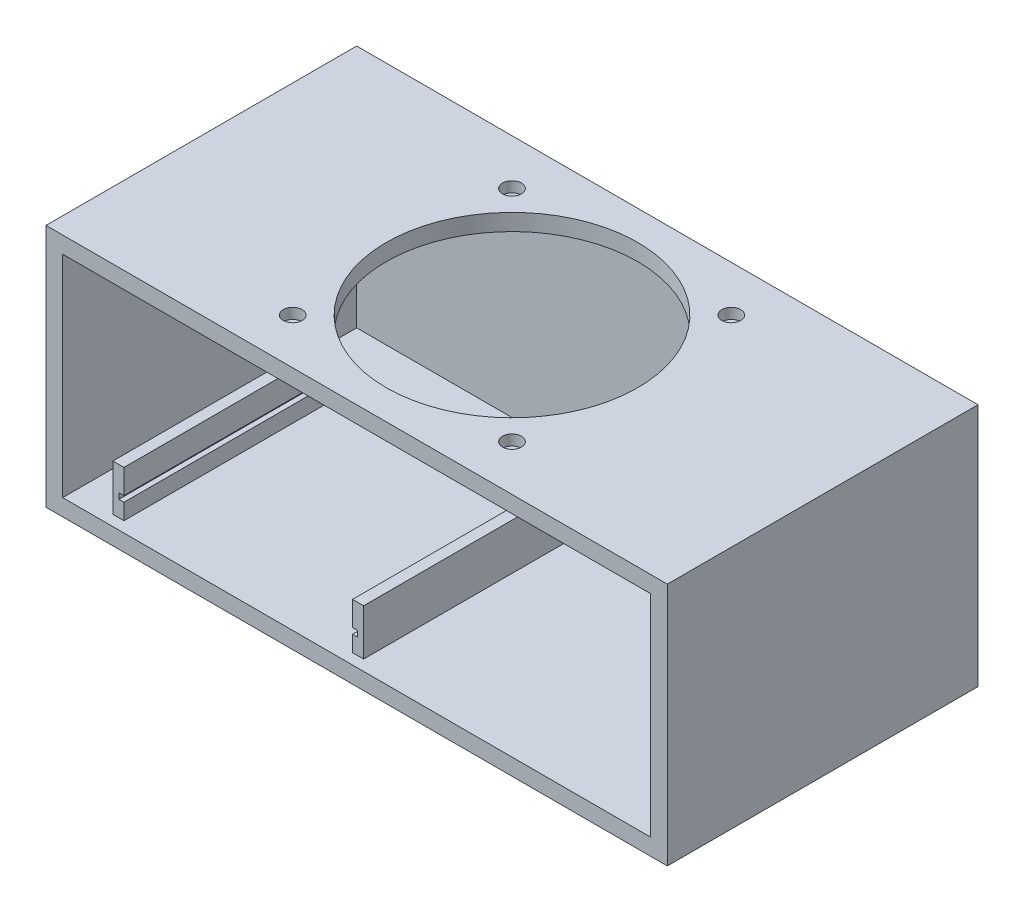
ISO-10303-21;
HEADER;
FILE_DESCRIPTION(('STEP AP214'),'2;1');
FILE_NAME('part.step','',(''),(''),'','','');
FILE_SCHEMA(('AUTOMOTIVE_DESIGN { 1 0 10303 214 1 1 1 1 }'));
ENDSEC;
DATA;
#1=APPLICATION_CONTEXT('core data for automotive mechanical design processes');
#2=APPLICATION_PROTOCOL_DEFINITION('international standard','automotive_design',2000,#1);
#3=PRODUCT_CONTEXT('',#1,'mechanical');
#4=PRODUCT('Part','Part','',(#3));
#5=PRODUCT_RELATED_PRODUCT_CATEGORY('part','',(#4));
#6=PRODUCT_DEFINITION_FORMATION('','',#4);
#7=PRODUCT_DEFINITION_CONTEXT('part definition',#1,'design');
#8=PRODUCT_DEFINITION('design','',#6,#7);
#9=PRODUCT_DEFINITION_SHAPE('','',#8);
#10=(LENGTH_UNIT() NAMED_UNIT(*) SI_UNIT(.MILLI.,.METRE.));
#11=(NAMED_UNIT(*) PLANE_ANGLE_UNIT() SI_UNIT($,.RADIAN.));
#12=(NAMED_UNIT(*) SI_UNIT($,.STERADIAN.) SOLID_ANGLE_UNIT());
#13=UNCERTAINTY_MEASURE_WITH_UNIT(LENGTH_MEASURE(1.E-05),#10,'distance_accuracy_value','');
#14=(GEOMETRIC_REPRESENTATION_CONTEXT(3) GLOBAL_UNCERTAINTY_ASSIGNED_CONTEXT((#13)) GLOBAL_UNIT_ASSIGNED_CONTEXT((#10,
#11,#12)) REPRESENTATION_CONTEXT('',''));
#15=CARTESIAN_POINT('',(0.,0.,0.));
#16=DIRECTION('',(0.,0.,1.));
#17=DIRECTION('',(1.,0.,0.));
#18=AXIS2_PLACEMENT_3D('',#15,#16,#17);
#19=CARTESIAN_POINT('',(-72.8217937762542,17.9705,41.4010618553118));
#20=DIRECTION('',(0.,0.,-1.));
#21=DIRECTION('',(-1.,0.,0.));
#22=AXIS2_PLACEMENT_3D('',#19,#20,#21);
#23=PLANE('',#22);
#24=DIRECTION('',(-1.,0.,0.));
#25=VECTOR('',#24,1.);
#26=CARTESIAN_POINT('',(-69.6467937762542,10.9855,41.4010618553118));
#27=LINE('',#26,#25);
#28=CARTESIAN_POINT('',(-69.6467937762542,10.9855,41.4010618553118));
#29=VERTEX_POINT('',#28);
#30=CARTESIAN_POINT('',(-71.0938670084245,10.9855,41.4010618553118));
#31=VERTEX_POINT('',#30);
#32=EDGE_CURVE('E265',#29,#31,#27,.T.);
#33=ORIENTED_EDGE('',*,*,#32,.F.);
#34=DIRECTION('',(0.,-1.,0.));
#35=VECTOR('',#34,1.);
#36=CARTESIAN_POINT('',(-69.6467937762542,17.9705,41.4010618553118));
#37=LINE('',#36,#35);
#38=CARTESIAN_POINT('',(-69.6467937762542,17.9705,41.4010618553118));
#39=VERTEX_POINT('',#38);
#40=EDGE_CURVE('E238',#39,#29,#37,.T.);
#41=ORIENTED_EDGE('',*,*,#40,.F.);
#42=DIRECTION('',(1.,0.,0.));
#43=VECTOR('',#42,1.);
#44=CARTESIAN_POINT('',(-72.8217937762542,17.9705,41.4010618553118));
#45=LINE('',#44,#43);
#46=CARTESIAN_POINT('',(-72.8217937762542,17.9705,41.4010618553118));
#47=VERTEX_POINT('',#46);
#48=EDGE_CURVE('E321',#47,#39,#45,.T.);
#49=ORIENTED_EDGE('',*,*,#48,.F.);
#50=DIRECTION('',(0.,-1.,0.));
#51=VECTOR('',#50,1.);
#52=CARTESIAN_POINT('',(-72.8217937762542,17.9705,41.4010618553118));
#53=LINE('',#52,#51);
#54=CARTESIAN_POINT('',(-72.8217937762542,4.7625,41.4010618553118));
#55=VERTEX_POINT('',#54);
#56=EDGE_CURVE('E317',#47,#55,#53,.T.);
#57=ORIENTED_EDGE('',*,*,#56,.T.);
#58=DIRECTION('',(1.,0.,0.));
#59=VECTOR('',#58,1.);
#60=CARTESIAN_POINT('',(-72.8217937762542,4.7625,41.4010618553118));
#61=LINE('',#60,#59);
#62=CARTESIAN_POINT('',(-69.6467937762542,4.7625,41.4010618553118));
#63=VERTEX_POINT('',#62);
#64=EDGE_CURVE('E290',#55,#63,#61,.T.);
#65=ORIENTED_EDGE('',*,*,#64,.T.);
#66=CARTESIAN_POINT('',(-69.6467937762542,9.3345,41.4010618553118));
#67=VERTEX_POINT('',#66);
#68=EDGE_CURVE('E309',#67,#63,#37,.T.);
#69=ORIENTED_EDGE('',*,*,#68,.F.);
#70=DIRECTION('',(1.,0.,0.));
#71=VECTOR('',#70,1.);
#72=CARTESIAN_POINT('',(-71.0938670084245,9.3345,41.4010618553118));
#73=LINE('',#72,#71);
#74=CARTESIAN_POINT('',(-71.0938670084245,9.3345,41.4010618553118));
#75=VERTEX_POINT('',#74);
#76=EDGE_CURVE('E231',#75,#67,#73,.T.);
#77=ORIENTED_EDGE('',*,*,#76,.F.);
#78=DIRECTION('',(0.,-1.,0.));
#79=VECTOR('',#78,1.);
#80=CARTESIAN_POINT('',(-71.0938670084245,10.9855,41.4010618553118));
#81=LINE('',#80,#79);
#82=EDGE_CURVE('E804',#31,#75,#81,.T.);
#83=ORIENTED_EDGE('',*,*,#82,.F.);
#84=EDGE_LOOP('',(#33,#41,#49,#57,#65,#69,#77,#83));
#85=FACE_BOUND('',#84,.T.);
#86=ADVANCED_FACE('F54',(#85),#23,.F.);
#87=CARTESIAN_POINT('',(-1.80962252424003E-13,17.9705,41.4010618553118));
#88=DIRECTION('',(0.,0.,-1.));
#89=DIRECTION('',(-1.,0.,0.));
#90=AXIS2_PLACEMENT_3D('',#87,#88,#89);
#91=PLANE('',#90);
#92=DIRECTION('',(-1.,0.,0.));
#93=VECTOR('',#92,1.);
#94=CARTESIAN_POINT('',(-4.24179377625425,10.9855,41.4010618553118));
#95=LINE('',#94,#93);
#96=CARTESIAN_POINT('',(-2.79472054408396,10.9855,41.4010618553118));
#97=VERTEX_POINT('',#96);
#98=CARTESIAN_POINT('',(-4.24179377625425,10.9855,41.4010618553118));
#99=VERTEX_POINT('',#98);
#100=EDGE_CURVE('E257',#97,#99,#95,.T.);
#101=ORIENTED_EDGE('',*,*,#100,.F.);
#102=DIRECTION('',(0.,1.,0.));
#103=VECTOR('',#102,1.);
#104=CARTESIAN_POINT('',(-2.79472054408396,10.9855,41.4010618553118));
#105=LINE('',#104,#103);
#106=CARTESIAN_POINT('',(-2.79472054408396,9.3345,41.4010618553118));
#107=VERTEX_POINT('',#106);
#108=EDGE_CURVE('E256',#107,#97,#105,.T.);
#109=ORIENTED_EDGE('',*,*,#108,.F.);
#110=DIRECTION('',(1.,0.,0.));
#111=VECTOR('',#110,1.);
#112=CARTESIAN_POINT('',(-2.79472054408396,9.3345,41.4010618553118));
#113=LINE('',#112,#111);
#114=CARTESIAN_POINT('',(-4.24179377625425,9.3345,41.4010618553118));
#115=VERTEX_POINT('',#114);
#116=EDGE_CURVE('E79',#115,#107,#113,.T.);
#117=ORIENTED_EDGE('',*,*,#116,.F.);
#118=DIRECTION('',(0.,-1.,0.));
#119=VECTOR('',#118,1.);
#120=CARTESIAN_POINT('',(-4.24179377625425,17.9705,41.4010618553118));
#121=LINE('',#120,#119);
#122=CARTESIAN_POINT('',(-4.24179377625425,4.7625,41.4010618553118));
#123=VERTEX_POINT('',#122);
#124=EDGE_CURVE('E300',#115,#123,#121,.T.);
#125=ORIENTED_EDGE('',*,*,#124,.T.);
#126=DIRECTION('',(1.,0.,0.));
#127=VECTOR('',#126,1.);
#128=CARTESIAN_POINT('',(-1.80962252424003E-13,4.7625,41.4010618553118));
#129=LINE('',#128,#127);
#130=CARTESIAN_POINT('',(-1.0667937762542,4.7625,41.4010618553118));
#131=VERTEX_POINT('',#130);
#132=EDGE_CURVE('E277',#123,#131,#129,.T.);
#133=ORIENTED_EDGE('',*,*,#132,.T.);
#134=DIRECTION('',(0.,-1.,0.));
#135=VECTOR('',#134,1.);
#136=CARTESIAN_POINT('',(-1.0667937762542,17.9705,41.4010618553118));
#137=LINE('',#136,#135);
#138=CARTESIAN_POINT('',(-1.0667937762542,17.9705,41.4010618553118));
#139=VERTEX_POINT('',#138);
#140=EDGE_CURVE('E285',#139,#131,#137,.T.);
#141=ORIENTED_EDGE('',*,*,#140,.F.);
#142=DIRECTION('',(1.,0.,0.));
#143=VECTOR('',#142,1.);
#144=CARTESIAN_POINT('',(-1.80962252424003E-13,17.9705,41.4010618553118));
#145=LINE('',#144,#143);
#146=CARTESIAN_POINT('',(-4.24179377625425,17.9705,41.4010618553118));
#147=VERTEX_POINT('',#146);
#148=EDGE_CURVE('E278',#147,#139,#145,.T.);
#149=ORIENTED_EDGE('',*,*,#148,.F.);
#150=EDGE_CURVE('E296',#147,#99,#121,.T.);
#151=ORIENTED_EDGE('',*,*,#150,.T.);
#152=EDGE_LOOP('',(#101,#109,#117,#125,#133,#141,#149,#151));
#153=FACE_BOUND('',#152,.T.);
#154=ADVANCED_FACE('F455',(#153),#91,.F.);
#155=CARTESIAN_POINT('',(0.,4.7625,0.));
#156=DIRECTION('',(0.,-1.,0.));
#157=DIRECTION('',(0.,0.,-1.));
#158=AXIS2_PLACEMENT_3D('',#155,#156,#157);
#159=PLANE('',#158);
#160=ORIENTED_EDGE('',*,*,#64,.F.);
#161=DIRECTION('',(0.,0.,1.));
#162=VECTOR('',#161,1.);
#163=CARTESIAN_POINT('',(-72.8217937762542,4.7625,0.));
#164=LINE('',#163,#162);
#165=CARTESIAN_POINT('',(-72.8217937762542,4.7625,-17.5496859054574));
#166=VERTEX_POINT('',#165);
#167=EDGE_CURVE('E318',#166,#55,#164,.T.);
#168=ORIENTED_EDGE('',*,*,#167,.F.);
#169=DIRECTION('',(1.,0.,0.));
#170=VECTOR('',#169,1.);
#171=CARTESIAN_POINT('',(-72.8217937762542,4.7625,-17.5496859054574));
#172=LINE('',#171,#170);
#173=CARTESIAN_POINT('',(-69.6467937762542,4.7625,-17.5496859054574));
#174=VERTEX_POINT('',#173);
#175=EDGE_CURVE('E324',#166,#174,#172,.T.);
#176=ORIENTED_EDGE('',*,*,#175,.T.);
#177=DIRECTION('',(0.,0.,-1.));
#178=VECTOR('',#177,1.);
#179=CARTESIAN_POINT('',(-69.6467937762542,4.7625,41.4010618553118));
#180=LINE('',#179,#178);
#181=EDGE_CURVE('E326',#63,#174,#180,.T.);
#182=ORIENTED_EDGE('',*,*,#181,.F.);
#183=EDGE_LOOP('',(#160,#168,#176,#182));
#184=FACE_BOUND('',#183,.T.);
#185=DIRECTION('',(0.,0.,-1.));
#186=VECTOR('',#185,1.);
#187=CARTESIAN_POINT('',(84.1375,4.7625,0.));
#188=LINE('',#187,#186);
#189=CARTESIAN_POINT('',(84.1375,4.7625,44.45));
#190=VERTEX_POINT('',#189);
#191=CARTESIAN_POINT('',(84.1375,4.7625,-39.6875));
#192=VERTEX_POINT('',#191);
#193=EDGE_CURVE('E362',#190,#192,#188,.T.);
#194=ORIENTED_EDGE('',*,*,#193,.T.);
#195=DIRECTION('',(-1.,0.,0.));
#196=VECTOR('',#195,1.);
#197=CARTESIAN_POINT('',(0.,4.7625,-39.6875));
#198=LINE('',#197,#196);
#199=CARTESIAN_POINT('',(-84.1375,4.7625,-39.6875));
#200=VERTEX_POINT('',#199);
#201=EDGE_CURVE('E368',#192,#200,#198,.T.);
#202=ORIENTED_EDGE('',*,*,#201,.T.);
#203=DIRECTION('',(0.,0.,1.));
#204=VECTOR('',#203,1.);
#205=CARTESIAN_POINT('',(-84.1375,4.7625,0.));
#206=LINE('',#205,#204);
#207=CARTESIAN_POINT('',(-84.1375,4.7625,44.45));
#208=VERTEX_POINT('',#207);
#209=EDGE_CURVE('E379',#200,#208,#206,.T.);
#210=ORIENTED_EDGE('',*,*,#209,.T.);
#211=DIRECTION('',(1.,0.,0.));
#212=VECTOR('',#211,1.);
#213=CARTESIAN_POINT('',(0.,4.7625,44.45));
#214=LINE('',#213,#212);
#215=EDGE_CURVE('E377',#208,#190,#214,.T.);
#216=ORIENTED_EDGE('',*,*,#215,.T.);
#217=EDGE_LOOP('',(#194,#202,#210,#216));
#218=FACE_BOUND('',#217,.T.);
#219=DIRECTION('',(0.,0.,-1.));
#220=VECTOR('',#219,1.);
#221=CARTESIAN_POINT('',(-1.0667937762542,4.7625,0.));
#222=LINE('',#221,#220);
#223=CARTESIAN_POINT('',(-1.0667937762542,4.7625,-17.5496859054574));
#224=VERTEX_POINT('',#223);
#225=EDGE_CURVE('E282',#131,#224,#222,.T.);
#226=ORIENTED_EDGE('',*,*,#225,.F.);
#227=ORIENTED_EDGE('',*,*,#132,.F.);
#228=DIRECTION('',(0.,0.,1.));
#229=VECTOR('',#228,1.);
#230=CARTESIAN_POINT('',(-4.24179377625425,4.7625,0.));
#231=LINE('',#230,#229);
#232=CARTESIAN_POINT('',(-4.24179377625425,4.7625,-17.5496859054574));
#233=VERTEX_POINT('',#232);
#234=EDGE_CURVE('E289',#233,#123,#231,.T.);
#235=ORIENTED_EDGE('',*,*,#234,.F.);
#236=DIRECTION('',(-1.,0.,0.));
#237=VECTOR('',#236,1.);
#238=CARTESIAN_POINT('',(0.,4.7625,-17.5496859054574));
#239=LINE('',#238,#237);
#240=EDGE_CURVE('E286',#224,#233,#239,.T.);
#241=ORIENTED_EDGE('',*,*,#240,.F.);
#242=EDGE_LOOP('',(#226,#227,#235,#241));
#243=FACE_BOUND('',#242,.T.);
#244=ADVANCED_FACE('F458',(#184,#218,#243),#159,.F.);
#245=CARTESIAN_POINT('',(0.,69.85,0.));
#246=DIRECTION('',(0.,-1.,0.));
#247=DIRECTION('',(0.,0.,-1.));
#248=AXIS2_PLACEMENT_3D('',#245,#246,#247);
#249=PLANE('',#248);
#250=CARTESIAN_POINT('',(31.3735987917704,69.85,31.373598791771));
#251=DIRECTION('',(0.,1.,0.));
#252=DIRECTION('',(0.,0.,1.));
#253=AXIS2_PLACEMENT_3D('',#250,#251,#252);
#254=CIRCLE('',#253,2.7);
#255=CARTESIAN_POINT('',(31.3735987917704,69.85,34.073598791771));
#256=VERTEX_POINT('',#255);
#257=EDGE_CURVE('E339',#256,#256,#254,.T.);
#258=ORIENTED_EDGE('',*,*,#257,.F.);
#259=EDGE_LOOP('',(#258));
#260=FACE_BOUND('',#259,.T.);
#261=CARTESIAN_POINT('',(-31.3735987917704,69.85,31.373598791771));
#262=DIRECTION('',(0.,-1.,0.));
#263=DIRECTION('',(0.,0.,-1.));
#264=AXIS2_PLACEMENT_3D('',#261,#262,#263);
#265=CIRCLE('',#264,2.7);
#266=CARTESIAN_POINT('',(-31.3735987917704,69.85,28.673598791771));
#267=VERTEX_POINT('',#266);
#268=EDGE_CURVE('E345',#267,#267,#265,.T.);
#269=ORIENTED_EDGE('',*,*,#268,.T.);
#270=EDGE_LOOP('',(#269));
#271=FACE_BOUND('',#270,.T.);
#272=CARTESIAN_POINT('',(0.,69.85,0.));
#273=DIRECTION('',(0.,1.,0.));
#274=DIRECTION('',(0.,0.,1.));
#275=AXIS2_PLACEMENT_3D('',#272,#273,#274);
#276=CIRCLE('',#275,36.);
#277=CARTESIAN_POINT('',(0.,69.85,36.));
#278=VERTEX_POINT('',#277);
#279=EDGE_CURVE('E359',#278,#278,#276,.T.);
#280=ORIENTED_EDGE('',*,*,#279,.F.);
#281=EDGE_LOOP('',(#280));
#282=FACE_BOUND('',#281,.T.);
#283=DIRECTION('',(0.,0.,-1.));
#284=VECTOR('',#283,1.);
#285=CARTESIAN_POINT('',(88.9,69.85,44.45));
#286=LINE('',#285,#284);
#287=CARTESIAN_POINT('',(88.9,69.85,44.45));
#288=VERTEX_POINT('',#287);
#289=CARTESIAN_POINT('',(88.9,69.85,-44.45));
#290=VERTEX_POINT('',#289);
#291=EDGE_CURVE('E397',#288,#290,#286,.T.);
#292=ORIENTED_EDGE('',*,*,#291,.T.);
#293=DIRECTION('',(-1.,0.,0.));
#294=VECTOR('',#293,1.);
#295=CARTESIAN_POINT('',(-88.9,69.85,-44.45));
#296=LINE('',#295,#294);
#297=CARTESIAN_POINT('',(-88.9,69.85,-44.45));
#298=VERTEX_POINT('',#297);
#299=EDGE_CURVE('E402',#290,#298,#296,.T.);
#300=ORIENTED_EDGE('',*,*,#299,.T.);
#301=DIRECTION('',(0.,0.,1.));
#302=VECTOR('',#301,1.);
#303=CARTESIAN_POINT('',(-88.9,69.85,44.45));
#304=LINE('',#303,#302);
#305=CARTESIAN_POINT('',(-88.9,69.85,44.45));
#306=VERTEX_POINT('',#305);
#307=EDGE_CURVE('E404',#298,#306,#304,.T.);
#308=ORIENTED_EDGE('',*,*,#307,.T.);
#309=DIRECTION('',(1.,0.,0.));
#310=VECTOR('',#309,1.);
#311=CARTESIAN_POINT('',(-88.9,69.85,44.45));
#312=LINE('',#311,#310);
#313=EDGE_CURVE('E407',#306,#288,#312,.T.);
#314=ORIENTED_EDGE('',*,*,#313,.T.);
#315=EDGE_LOOP('',(#292,#300,#308,#314));
#316=FACE_BOUND('',#315,.T.);
#317=CARTESIAN_POINT('',(31.3735987917709,69.85,-31.373598791771));
#318=DIRECTION('',(0.,-1.,0.));
#319=DIRECTION('',(0.,0.,-1.));
#320=AXIS2_PLACEMENT_3D('',#317,#318,#319);
#321=CIRCLE('',#320,2.7);
#322=CARTESIAN_POINT('',(31.3735987917709,69.85,-34.073598791771));
#323=VERTEX_POINT('',#322);
#324=EDGE_CURVE('E346',#323,#323,#321,.T.);
#325=ORIENTED_EDGE('',*,*,#324,.T.);
#326=EDGE_LOOP('',(#325));
#327=FACE_BOUND('',#326,.T.);
#328=CARTESIAN_POINT('',(-31.3735987917709,69.85,-31.373598791771));
#329=DIRECTION('',(0.,1.,0.));
#330=DIRECTION('',(0.,0.,1.));
#331=AXIS2_PLACEMENT_3D('',#328,#329,#330);
#332=CIRCLE('',#331,2.7);
#333=CARTESIAN_POINT('',(-31.3735987917709,69.85,-28.673598791771));
#334=VERTEX_POINT('',#333);
#335=EDGE_CURVE('E355',#334,#334,#332,.T.);
#336=ORIENTED_EDGE('',*,*,#335,.F.);
#337=EDGE_LOOP('',(#336));
#338=FACE_BOUND('',#337,.T.);
#339=ADVANCED_FACE('F445',(#260,#271,#282,#316,#327,#338),#249,.F.);
#340=CARTESIAN_POINT('',(-88.9,69.85,44.45));
#341=DIRECTION('',(0.,0.,-1.));
#342=DIRECTION('',(-1.,0.,0.));
#343=AXIS2_PLACEMENT_3D('',#340,#341,#342);
#344=PLANE('',#343);
#345=DIRECTION('',(1.,0.,0.));
#346=VECTOR('',#345,1.);
#347=CARTESIAN_POINT('',(-88.9,0.,44.45));
#348=LINE('',#347,#346);
#349=CARTESIAN_POINT('',(-88.9,0.,44.45));
#350=VERTEX_POINT('',#349);
#351=CARTESIAN_POINT('',(88.9,0.,44.45));
#352=VERTEX_POINT('',#351);
#353=EDGE_CURVE('E405',#350,#352,#348,.T.);
#354=ORIENTED_EDGE('',*,*,#353,.T.);
#355=DIRECTION('',(0.,-1.,0.));
#356=VECTOR('',#355,1.);
#357=CARTESIAN_POINT('',(88.9,69.85,44.45));
#358=LINE('',#357,#356);
#359=EDGE_CURVE('E409',#288,#352,#358,.T.);
#360=ORIENTED_EDGE('',*,*,#359,.F.);
#361=ORIENTED_EDGE('',*,*,#313,.F.);
#362=DIRECTION('',(0.,-1.,0.));
#363=VECTOR('',#362,1.);
#364=CARTESIAN_POINT('',(-88.9,69.85,44.45));
#365=LINE('',#364,#363);
#366=EDGE_CURVE('E417',#306,#350,#365,.T.);
#367=ORIENTED_EDGE('',*,*,#366,.T.);
#368=EDGE_LOOP('',(#354,#360,#361,#367));
#369=FACE_BOUND('',#368,.T.);
#370=ORIENTED_EDGE('',*,*,#215,.F.);
#371=DIRECTION('',(0.,-1.,0.));
#372=VECTOR('',#371,1.);
#373=CARTESIAN_POINT('',(-84.1375,69.85,44.45));
#374=LINE('',#373,#372);
#375=CARTESIAN_POINT('',(-84.1375,65.0875,44.45));
#376=VERTEX_POINT('',#375);
#377=EDGE_CURVE('E384',#376,#208,#374,.T.);
#378=ORIENTED_EDGE('',*,*,#377,.F.);
#379=DIRECTION('',(1.,0.,0.));
#380=VECTOR('',#379,1.);
#381=CARTESIAN_POINT('',(0.,65.0875,44.45));
#382=LINE('',#381,#380);
#383=CARTESIAN_POINT('',(84.1375,65.0875,44.45));
#384=VERTEX_POINT('',#383);
#385=EDGE_CURVE('E386',#376,#384,#382,.T.);
#386=ORIENTED_EDGE('',*,*,#385,.T.);
#387=DIRECTION('',(0.,-1.,0.));
#388=VECTOR('',#387,1.);
#389=CARTESIAN_POINT('',(84.1375,69.85,44.45));
#390=LINE('',#389,#388);
#391=EDGE_CURVE('E388',#384,#190,#390,.T.);
#392=ORIENTED_EDGE('',*,*,#391,.T.);
#393=EDGE_LOOP('',(#370,#378,#386,#392));
#394=FACE_BOUND('',#393,.T.);
#395=ADVANCED_FACE('F434',(#369,#394),#344,.F.);
#396=CARTESIAN_POINT('',(88.9,69.85,44.45));
#397=DIRECTION('',(-1.,0.,0.));
#398=DIRECTION('',(0.,0.,1.));
#399=AXIS2_PLACEMENT_3D('',#396,#397,#398);
#400=PLANE('',#399);
#401=DIRECTION('',(0.,0.,-1.));
#402=VECTOR('',#401,1.);
#403=CARTESIAN_POINT('',(88.9,0.,44.45));
#404=LINE('',#403,#402);
#405=CARTESIAN_POINT('',(88.9,0.,-44.45));
#406=VERTEX_POINT('',#405);
#407=EDGE_CURVE('E375',#352,#406,#404,.T.);
#408=ORIENTED_EDGE('',*,*,#407,.T.);
#409=DIRECTION('',(0.,-1.,0.));
#410=VECTOR('',#409,1.);
#411=CARTESIAN_POINT('',(88.9,69.85,-44.45));
#412=LINE('',#411,#410);
#413=EDGE_CURVE('E13',#290,#406,#412,.T.);
#414=ORIENTED_EDGE('',*,*,#413,.F.);
#415=ORIENTED_EDGE('',*,*,#291,.F.);
#416=ORIENTED_EDGE('',*,*,#359,.T.);
#417=EDGE_LOOP('',(#408,#414,#415,#416));
#418=FACE_BOUND('',#417,.T.);
#419=ADVANCED_FACE('F60',(#418),#400,.F.);
#420=CARTESIAN_POINT('',(-88.9,69.85,-44.45));
#421=DIRECTION('',(0.,0.,1.));
#422=DIRECTION('',(1.,0.,0.));
#423=AXIS2_PLACEMENT_3D('',#420,#421,#422);
#424=PLANE('',#423);
#425=DIRECTION('',(-1.,0.,0.));
#426=VECTOR('',#425,1.);
#427=CARTESIAN_POINT('',(-88.9,0.,-44.45));
#428=LINE('',#427,#426);
#429=CARTESIAN_POINT('',(-88.9,0.,-44.45));
#430=VERTEX_POINT('',#429);
#431=EDGE_CURVE('E411',#406,#430,#428,.T.);
#432=ORIENTED_EDGE('',*,*,#431,.T.);
#433=DIRECTION('',(0.,-1.,0.));
#434=VECTOR('',#433,1.);
#435=CARTESIAN_POINT('',(-88.9,69.85,-44.45));
#436=LINE('',#435,#434);
#437=EDGE_CURVE('E61',#298,#430,#436,.T.);
#438=ORIENTED_EDGE('',*,*,#437,.F.);
#439=ORIENTED_EDGE('',*,*,#299,.F.);
#440=ORIENTED_EDGE('',*,*,#413,.T.);
#441=EDGE_LOOP('',(#432,#438,#439,#440));
#442=FACE_BOUND('',#441,.T.);
#443=ADVANCED_FACE('F443',(#442),#424,.F.);
#444=CARTESIAN_POINT('',(-88.9,69.85,44.45));
#445=DIRECTION('',(1.,0.,0.));
#446=DIRECTION('',(0.,0.,-1.));
#447=AXIS2_PLACEMENT_3D('',#444,#445,#446);
#448=PLANE('',#447);
#449=DIRECTION('',(0.,0.,1.));
#450=VECTOR('',#449,1.);
#451=CARTESIAN_POINT('',(-88.9,0.,44.45));
#452=LINE('',#451,#450);
#453=EDGE_CURVE('E412',#430,#350,#452,.T.);
#454=ORIENTED_EDGE('',*,*,#453,.T.);
#455=ORIENTED_EDGE('',*,*,#366,.F.);
#456=ORIENTED_EDGE('',*,*,#307,.F.);
#457=ORIENTED_EDGE('',*,*,#437,.T.);
#458=EDGE_LOOP('',(#454,#455,#456,#457));
#459=FACE_BOUND('',#458,.T.);
#460=ADVANCED_FACE('F428',(#459),#448,.F.);
#461=CARTESIAN_POINT('',(0.,0.,0.));
#462=DIRECTION('',(0.,-1.,0.));
#463=DIRECTION('',(0.,0.,-1.));
#464=AXIS2_PLACEMENT_3D('',#461,#462,#463);
#465=PLANE('',#464);
#466=ORIENTED_EDGE('',*,*,#407,.F.);
#467=ORIENTED_EDGE('',*,*,#353,.F.);
#468=ORIENTED_EDGE('',*,*,#453,.F.);
#469=ORIENTED_EDGE('',*,*,#431,.F.);
#470=EDGE_LOOP('',(#466,#467,#468,#469));
#471=FACE_BOUND('',#470,.T.);
#472=ADVANCED_FACE('F435',(#471),#465,.T.);
#473=CARTESIAN_POINT('',(84.1375,69.85,44.45));
#474=DIRECTION('',(-1.,0.,0.));
#475=DIRECTION('',(0.,0.,1.));
#476=AXIS2_PLACEMENT_3D('',#473,#474,#475);
#477=PLANE('',#476);
#478=ORIENTED_EDGE('',*,*,#193,.F.);
#479=ORIENTED_EDGE('',*,*,#391,.F.);
#480=DIRECTION('',(0.,0.,-1.));
#481=VECTOR('',#480,1.);
#482=CARTESIAN_POINT('',(84.1375,65.0875,0.));
#483=LINE('',#482,#481);
#484=CARTESIAN_POINT('',(84.1375,65.0875,-39.6875));
#485=VERTEX_POINT('',#484);
#486=EDGE_CURVE('E372',#384,#485,#483,.T.);
#487=ORIENTED_EDGE('',*,*,#486,.T.);
#488=DIRECTION('',(0.,-1.,0.));
#489=VECTOR('',#488,1.);
#490=CARTESIAN_POINT('',(84.1375,69.85,-39.6875));
#491=LINE('',#490,#489);
#492=EDGE_CURVE('E367',#485,#192,#491,.T.);
#493=ORIENTED_EDGE('',*,*,#492,.T.);
#494=EDGE_LOOP('',(#478,#479,#487,#493));
#495=FACE_BOUND('',#494,.T.);
#496=ADVANCED_FACE('F520',(#495),#477,.T.);
#497=CARTESIAN_POINT('',(-88.9,69.85,-39.6875));
#498=DIRECTION('',(0.,0.,1.));
#499=DIRECTION('',(1.,0.,0.));
#500=AXIS2_PLACEMENT_3D('',#497,#498,#499);
#501=PLANE('',#500);
#502=ORIENTED_EDGE('',*,*,#201,.F.);
#503=ORIENTED_EDGE('',*,*,#492,.F.);
#504=DIRECTION('',(-1.,0.,0.));
#505=VECTOR('',#504,1.);
#506=CARTESIAN_POINT('',(0.,65.0875,-39.6875));
#507=LINE('',#506,#505);
#508=CARTESIAN_POINT('',(-84.1375,65.0875,-39.6875));
#509=VERTEX_POINT('',#508);
#510=EDGE_CURVE('E380',#485,#509,#507,.T.);
#511=ORIENTED_EDGE('',*,*,#510,.T.);
#512=DIRECTION('',(0.,-1.,0.));
#513=VECTOR('',#512,1.);
#514=CARTESIAN_POINT('',(-84.1375,69.85,-39.6875));
#515=LINE('',#514,#513);
#516=EDGE_CURVE('E373',#509,#200,#515,.T.);
#517=ORIENTED_EDGE('',*,*,#516,.T.);
#518=EDGE_LOOP('',(#502,#503,#511,#517));
#519=FACE_BOUND('',#518,.T.);
#520=ADVANCED_FACE('F518',(#519),#501,.T.);
#521=CARTESIAN_POINT('',(-84.1375,69.85,44.45));
#522=DIRECTION('',(1.,0.,0.));
#523=DIRECTION('',(0.,0.,-1.));
#524=AXIS2_PLACEMENT_3D('',#521,#522,#523);
#525=PLANE('',#524);
#526=ORIENTED_EDGE('',*,*,#209,.F.);
#527=ORIENTED_EDGE('',*,*,#516,.F.);
#528=DIRECTION('',(0.,0.,1.));
#529=VECTOR('',#528,1.);
#530=CARTESIAN_POINT('',(-84.1375,65.0875,0.));
#531=LINE('',#530,#529);
#532=EDGE_CURVE('E383',#509,#376,#531,.T.);
#533=ORIENTED_EDGE('',*,*,#532,.T.);
#534=ORIENTED_EDGE('',*,*,#377,.T.);
#535=EDGE_LOOP('',(#526,#527,#533,#534));
#536=FACE_BOUND('',#535,.T.);
#537=ADVANCED_FACE('F523',(#536),#525,.T.);
#538=CARTESIAN_POINT('',(0.,65.0875,0.));
#539=DIRECTION('',(0.,-1.,0.));
#540=DIRECTION('',(0.,0.,-1.));
#541=AXIS2_PLACEMENT_3D('',#538,#539,#540);
#542=PLANE('',#541);
#543=CARTESIAN_POINT('',(0.,65.0875,0.));
#544=DIRECTION('',(0.,-1.,0.));
#545=DIRECTION('',(0.,0.,-1.));
#546=AXIS2_PLACEMENT_3D('',#543,#544,#545);
#547=CIRCLE('',#546,36.);
#548=CARTESIAN_POINT('',(0.,65.0875,-36.));
#549=VERTEX_POINT('',#548);
#550=EDGE_CURVE('E56',#549,#549,#547,.T.);
#551=ORIENTED_EDGE('',*,*,#550,.F.);
#552=EDGE_LOOP('',(#551));
#553=FACE_BOUND('',#552,.T.);
#554=ORIENTED_EDGE('',*,*,#486,.F.);
#555=ORIENTED_EDGE('',*,*,#385,.F.);
#556=ORIENTED_EDGE('',*,*,#532,.F.);
#557=ORIENTED_EDGE('',*,*,#510,.F.);
#558=EDGE_LOOP('',(#554,#555,#556,#557));
#559=FACE_BOUND('',#558,.T.);
#560=ADVANCED_FACE('F513',(#553,#559),#542,.T.);
#561=CARTESIAN_POINT('',(0.,11.938,0.));
#562=DIRECTION('',(0.,1.,0.));
#563=DIRECTION('',(0.,0.,1.));
#564=AXIS2_PLACEMENT_3D('',#561,#562,#563);
#565=CYLINDRICAL_SURFACE('',#564,36.);
#566=ORIENTED_EDGE('',*,*,#550,.T.);
#567=EDGE_LOOP('',(#566));
#568=FACE_BOUND('',#567,.T.);
#569=ORIENTED_EDGE('',*,*,#279,.T.);
#570=EDGE_LOOP('',(#569));
#571=FACE_BOUND('',#570,.T.);
#572=ADVANCED_FACE('F512',(#568,#571),#565,.F.);
#573=CARTESIAN_POINT('',(-31.3735987917704,66.85,31.373598791771));
#574=DIRECTION('',(0.,1.,0.));
#575=DIRECTION('',(0.,0.,1.));
#576=AXIS2_PLACEMENT_3D('',#573,#574,#575);
#577=CYLINDRICAL_SURFACE('',#576,2.7);
#578=CARTESIAN_POINT('',(-31.3735987917704,66.85,31.373598791771));
#579=DIRECTION('',(0.,-1.,0.));
#580=DIRECTION('',(0.,0.,-1.));
#581=AXIS2_PLACEMENT_3D('',#578,#579,#580);
#582=CIRCLE('',#581,2.7);
#583=CARTESIAN_POINT('',(-31.3735987917704,66.85,28.673598791771));
#584=VERTEX_POINT('',#583);
#585=EDGE_CURVE('E357',#584,#584,#582,.T.);
#586=ORIENTED_EDGE('',*,*,#585,.T.);
#587=EDGE_LOOP('',(#586));
#588=FACE_BOUND('',#587,.T.);
#589=ORIENTED_EDGE('',*,*,#268,.F.);
#590=EDGE_LOOP('',(#589));
#591=FACE_BOUND('',#590,.T.);
#592=ADVANCED_FACE('F510',(#588,#591),#577,.F.);
#593=CARTESIAN_POINT('',(-31.3735987917704,66.85,31.373598791771));
#594=DIRECTION('',(0.,-1.,0.));
#595=DIRECTION('',(0.,0.,-1.));
#596=AXIS2_PLACEMENT_3D('',#593,#594,#595);
#597=PLANE('',#596);
#598=ORIENTED_EDGE('',*,*,#585,.F.);
#599=EDGE_LOOP('',(#598));
#600=FACE_BOUND('',#599,.T.);
#601=ADVANCED_FACE('F484',(#600),#597,.F.);
#602=CARTESIAN_POINT('',(31.3735987917704,66.85,31.373598791771));
#603=DIRECTION('',(0.,1.,0.));
#604=DIRECTION('',(0.,0.,1.));
#605=AXIS2_PLACEMENT_3D('',#602,#603,#604);
#606=CYLINDRICAL_SURFACE('',#605,2.7);
#607=CARTESIAN_POINT('',(31.3735987917704,66.85,31.373598791771));
#608=DIRECTION('',(0.,1.,0.));
#609=DIRECTION('',(0.,0.,1.));
#610=AXIS2_PLACEMENT_3D('',#607,#608,#609);
#611=CIRCLE('',#610,2.7);
#612=CARTESIAN_POINT('',(31.3735987917704,66.85,34.073598791771));
#613=VERTEX_POINT('',#612);
#614=EDGE_CURVE('E344',#613,#613,#611,.T.);
#615=ORIENTED_EDGE('',*,*,#614,.F.);
#616=EDGE_LOOP('',(#615));
#617=FACE_BOUND('',#616,.T.);
#618=ORIENTED_EDGE('',*,*,#257,.T.);
#619=EDGE_LOOP('',(#618));
#620=FACE_BOUND('',#619,.T.);
#621=ADVANCED_FACE('F481',(#617,#620),#606,.F.);
#622=CARTESIAN_POINT('',(31.3735987917704,66.85,31.373598791771));
#623=DIRECTION('',(0.,1.,0.));
#624=DIRECTION('',(0.,0.,1.));
#625=AXIS2_PLACEMENT_3D('',#622,#623,#624);
#626=PLANE('',#625);
#627=ORIENTED_EDGE('',*,*,#614,.T.);
#628=EDGE_LOOP('',(#627));
#629=FACE_BOUND('',#628,.T.);
#630=ADVANCED_FACE('F483',(#629),#626,.T.);
#631=CARTESIAN_POINT('',(31.3735987917709,66.85,-31.373598791771));
#632=DIRECTION('',(0.,1.,0.));
#633=DIRECTION('',(0.,0.,1.));
#634=AXIS2_PLACEMENT_3D('',#631,#632,#633);
#635=CYLINDRICAL_SURFACE('',#634,2.7);
#636=CARTESIAN_POINT('',(31.3735987917709,66.85,-31.373598791771));
#637=DIRECTION('',(0.,-1.,0.));
#638=DIRECTION('',(0.,0.,-1.));
#639=AXIS2_PLACEMENT_3D('',#636,#637,#638);
#640=CIRCLE('',#639,2.7);
#641=CARTESIAN_POINT('',(31.3735987917709,66.85,-34.073598791771));
#642=VERTEX_POINT('',#641);
#643=EDGE_CURVE('E348',#642,#642,#640,.T.);
#644=ORIENTED_EDGE('',*,*,#643,.T.);
#645=EDGE_LOOP('',(#644));
#646=FACE_BOUND('',#645,.T.);
#647=ORIENTED_EDGE('',*,*,#324,.F.);
#648=EDGE_LOOP('',(#647));
#649=FACE_BOUND('',#648,.T.);
#650=ADVANCED_FACE('F490',(#646,#649),#635,.F.);
#651=CARTESIAN_POINT('',(31.3735987917709,66.85,-31.373598791771));
#652=DIRECTION('',(0.,-1.,0.));
#653=DIRECTION('',(0.,0.,-1.));
#654=AXIS2_PLACEMENT_3D('',#651,#652,#653);
#655=PLANE('',#654);
#656=ORIENTED_EDGE('',*,*,#643,.F.);
#657=EDGE_LOOP('',(#656));
#658=FACE_BOUND('',#657,.T.);
#659=ADVANCED_FACE('F491',(#658),#655,.F.);
#660=CARTESIAN_POINT('',(-31.3735987917709,66.85,-31.373598791771));
#661=DIRECTION('',(0.,1.,0.));
#662=DIRECTION('',(0.,0.,1.));
#663=AXIS2_PLACEMENT_3D('',#660,#661,#662);
#664=CYLINDRICAL_SURFACE('',#663,2.7);
#665=CARTESIAN_POINT('',(-31.3735987917709,66.85,-31.373598791771));
#666=DIRECTION('',(0.,1.,0.));
#667=DIRECTION('',(0.,0.,1.));
#668=AXIS2_PLACEMENT_3D('',#665,#666,#667);
#669=CIRCLE('',#668,2.7);
#670=CARTESIAN_POINT('',(-31.3735987917709,66.85,-28.673598791771));
#671=VERTEX_POINT('',#670);
#672=EDGE_CURVE('E310',#671,#671,#669,.T.);
#673=ORIENTED_EDGE('',*,*,#672,.F.);
#674=EDGE_LOOP('',(#673));
#675=FACE_BOUND('',#674,.T.);
#676=ORIENTED_EDGE('',*,*,#335,.T.);
#677=EDGE_LOOP('',(#676));
#678=FACE_BOUND('',#677,.T.);
#679=ADVANCED_FACE('F500',(#675,#678),#664,.F.);
#680=CARTESIAN_POINT('',(-31.3735987917709,66.85,-31.373598791771));
#681=DIRECTION('',(0.,1.,0.));
#682=DIRECTION('',(0.,0.,1.));
#683=AXIS2_PLACEMENT_3D('',#680,#681,#682);
#684=PLANE('',#683);
#685=ORIENTED_EDGE('',*,*,#672,.T.);
#686=EDGE_LOOP('',(#685));
#687=FACE_BOUND('',#686,.T.);
#688=ADVANCED_FACE('F469',(#687),#684,.T.);
#689=CARTESIAN_POINT('',(-69.6467937762542,17.9705,41.4010618553118));
#690=DIRECTION('',(-1.,0.,0.));
#691=DIRECTION('',(0.,0.,1.));
#692=AXIS2_PLACEMENT_3D('',#689,#690,#691);
#693=PLANE('',#692);
#694=DIRECTION('',(0.,1.,0.));
#695=VECTOR('',#694,1.);
#696=CARTESIAN_POINT('',(-69.6467937762542,9.3345,-14.7329381446882));
#697=LINE('',#696,#695);
#698=CARTESIAN_POINT('',(-69.6467937762542,9.3345,-14.7329381446882));
#699=VERTEX_POINT('',#698);
#700=CARTESIAN_POINT('',(-69.6467937762542,10.9855,-14.7329381446882));
#701=VERTEX_POINT('',#700);
#702=EDGE_CURVE('E227',#699,#701,#697,.T.);
#703=ORIENTED_EDGE('',*,*,#702,.F.);
#704=DIRECTION('',(0.,0.,1.));
#705=VECTOR('',#704,1.);
#706=CARTESIAN_POINT('',(-69.6467937762542,9.3345,-14.7329381446882));
#707=LINE('',#706,#705);
#708=EDGE_CURVE('E812',#699,#67,#707,.T.);
#709=ORIENTED_EDGE('',*,*,#708,.T.);
#710=ORIENTED_EDGE('',*,*,#68,.T.);
#711=ORIENTED_EDGE('',*,*,#181,.T.);
#712=DIRECTION('',(0.,-1.,0.));
#713=VECTOR('',#712,1.);
#714=CARTESIAN_POINT('',(-69.6467937762542,17.9705,-17.5496859054574));
#715=LINE('',#714,#713);
#716=CARTESIAN_POINT('',(-69.6467937762542,17.9705,-17.5496859054574));
#717=VERTEX_POINT('',#716);
#718=EDGE_CURVE('E307',#717,#174,#715,.T.);
#719=ORIENTED_EDGE('',*,*,#718,.F.);
#720=DIRECTION('',(0.,0.,-1.));
#721=VECTOR('',#720,1.);
#722=CARTESIAN_POINT('',(-69.6467937762542,17.9705,41.4010618553118));
#723=LINE('',#722,#721);
#724=EDGE_CURVE('E334',#39,#717,#723,.T.);
#725=ORIENTED_EDGE('',*,*,#724,.F.);
#726=ORIENTED_EDGE('',*,*,#40,.T.);
#727=DIRECTION('',(0.,0.,1.));
#728=VECTOR('',#727,1.);
#729=CARTESIAN_POINT('',(-69.6467937762542,10.9855,-14.7329381446882));
#730=LINE('',#729,#728);
#731=EDGE_CURVE('E225',#701,#29,#730,.T.);
#732=ORIENTED_EDGE('',*,*,#731,.F.);
#733=EDGE_LOOP('',(#703,#709,#710,#711,#719,#725,#726,#732));
#734=FACE_BOUND('',#733,.T.);
#735=ADVANCED_FACE('F236',(#734),#693,.F.);
#736=CARTESIAN_POINT('',(-72.8217937762542,17.9705,-17.5496859054574));
#737=DIRECTION('',(0.,0.,-1.));
#738=DIRECTION('',(-1.,0.,0.));
#739=AXIS2_PLACEMENT_3D('',#736,#737,#738);
#740=PLANE('',#739);
#741=ORIENTED_EDGE('',*,*,#175,.F.);
#742=DIRECTION('',(0.,-1.,0.));
#743=VECTOR('',#742,1.);
#744=CARTESIAN_POINT('',(-72.8217937762542,17.9705,-17.5496859054574));
#745=LINE('',#744,#743);
#746=CARTESIAN_POINT('',(-72.8217937762542,17.9705,-17.5496859054574));
#747=VERTEX_POINT('',#746);
#748=EDGE_CURVE('E312',#747,#166,#745,.T.);
#749=ORIENTED_EDGE('',*,*,#748,.F.);
#750=DIRECTION('',(1.,0.,0.));
#751=VECTOR('',#750,1.);
#752=CARTESIAN_POINT('',(-72.8217937762542,17.9705,-17.5496859054574));
#753=LINE('',#752,#751);
#754=EDGE_CURVE('E335',#747,#717,#753,.T.);
#755=ORIENTED_EDGE('',*,*,#754,.T.);
#756=ORIENTED_EDGE('',*,*,#718,.T.);
#757=EDGE_LOOP('',(#741,#749,#755,#756));
#758=FACE_BOUND('',#757,.T.);
#759=ADVANCED_FACE('F466',(#758),#740,.T.);
#760=CARTESIAN_POINT('',(-72.8217937762542,17.9705,0.));
#761=DIRECTION('',(1.,0.,0.));
#762=DIRECTION('',(0.,0.,-1.));
#763=AXIS2_PLACEMENT_3D('',#760,#761,#762);
#764=PLANE('',#763);
#765=ORIENTED_EDGE('',*,*,#167,.T.);
#766=ORIENTED_EDGE('',*,*,#56,.F.);
#767=DIRECTION('',(0.,0.,1.));
#768=VECTOR('',#767,1.);
#769=CARTESIAN_POINT('',(-72.8217937762542,17.9705,-17.5496859054574));
#770=LINE('',#769,#768);
#771=EDGE_CURVE('E316',#747,#47,#770,.T.);
#772=ORIENTED_EDGE('',*,*,#771,.F.);
#773=ORIENTED_EDGE('',*,*,#748,.T.);
#774=EDGE_LOOP('',(#765,#766,#772,#773));
#775=FACE_BOUND('',#774,.T.);
#776=ADVANCED_FACE('F475',(#775),#764,.F.);
#777=CARTESIAN_POINT('',(0.,17.9705,0.));
#778=DIRECTION('',(0.,1.,0.));
#779=DIRECTION('',(0.,0.,1.));
#780=AXIS2_PLACEMENT_3D('',#777,#778,#779);
#781=PLANE('',#780);
#782=ORIENTED_EDGE('',*,*,#48,.T.);
#783=ORIENTED_EDGE('',*,*,#724,.T.);
#784=ORIENTED_EDGE('',*,*,#754,.F.);
#785=ORIENTED_EDGE('',*,*,#771,.T.);
#786=EDGE_LOOP('',(#782,#783,#784,#785));
#787=FACE_BOUND('',#786,.T.);
#788=ADVANCED_FACE('F476',(#787),#781,.T.);
#789=CARTESIAN_POINT('',(-1.0667937762542,17.9705,0.));
#790=DIRECTION('',(-1.,0.,0.));
#791=DIRECTION('',(0.,0.,1.));
#792=AXIS2_PLACEMENT_3D('',#789,#790,#791);
#793=PLANE('',#792);
#794=ORIENTED_EDGE('',*,*,#225,.T.);
#795=DIRECTION('',(0.,-1.,0.));
#796=VECTOR('',#795,1.);
#797=CARTESIAN_POINT('',(-1.0667937762542,17.9705,-17.5496859054574));
#798=LINE('',#797,#796);
#799=CARTESIAN_POINT('',(-1.0667937762542,17.9705,-17.5496859054574));
#800=VERTEX_POINT('',#799);
#801=EDGE_CURVE('E302',#800,#224,#798,.T.);
#802=ORIENTED_EDGE('',*,*,#801,.F.);
#803=DIRECTION('',(0.,0.,-1.));
#804=VECTOR('',#803,1.);
#805=CARTESIAN_POINT('',(-1.0667937762542,17.9705,0.));
#806=LINE('',#805,#804);
#807=EDGE_CURVE('E275',#139,#800,#806,.T.);
#808=ORIENTED_EDGE('',*,*,#807,.F.);
#809=ORIENTED_EDGE('',*,*,#140,.T.);
#810=EDGE_LOOP('',(#794,#802,#808,#809));
#811=FACE_BOUND('',#810,.T.);
#812=ADVANCED_FACE('F463',(#811),#793,.F.);
#813=CARTESIAN_POINT('',(0.,17.9705,-17.5496859054574));
#814=DIRECTION('',(0.,0.,1.));
#815=DIRECTION('',(1.,0.,0.));
#816=AXIS2_PLACEMENT_3D('',#813,#814,#815);
#817=PLANE('',#816);
#818=ORIENTED_EDGE('',*,*,#240,.T.);
#819=DIRECTION('',(0.,-1.,0.));
#820=VECTOR('',#819,1.);
#821=CARTESIAN_POINT('',(-4.24179377625425,17.9705,-17.5496859054574));
#822=LINE('',#821,#820);
#823=CARTESIAN_POINT('',(-4.24179377625425,17.9705,-17.5496859054574));
#824=VERTEX_POINT('',#823);
#825=EDGE_CURVE('E301',#824,#233,#822,.T.);
#826=ORIENTED_EDGE('',*,*,#825,.F.);
#827=DIRECTION('',(-1.,0.,0.));
#828=VECTOR('',#827,1.);
#829=CARTESIAN_POINT('',(0.,17.9705,-17.5496859054574));
#830=LINE('',#829,#828);
#831=EDGE_CURVE('E273',#800,#824,#830,.T.);
#832=ORIENTED_EDGE('',*,*,#831,.F.);
#833=ORIENTED_EDGE('',*,*,#801,.T.);
#834=EDGE_LOOP('',(#818,#826,#832,#833));
#835=FACE_BOUND('',#834,.T.);
#836=ADVANCED_FACE('F644',(#835),#817,.F.);
#837=CARTESIAN_POINT('',(-4.24179377625425,17.9705,0.));
#838=DIRECTION('',(1.,0.,0.));
#839=DIRECTION('',(0.,0.,-1.));
#840=AXIS2_PLACEMENT_3D('',#837,#838,#839);
#841=PLANE('',#840);
#842=DIRECTION('',(0.,-1.,0.));
#843=VECTOR('',#842,1.);
#844=CARTESIAN_POINT('',(-4.24179377625425,9.3345,-14.7329381446882));
#845=LINE('',#844,#843);
#846=CARTESIAN_POINT('',(-4.24179377625425,10.9855,-14.7329381446882));
#847=VERTEX_POINT('',#846);
#848=CARTESIAN_POINT('',(-4.24179377625425,9.3345,-14.7329381446882));
#849=VERTEX_POINT('',#848);
#850=EDGE_CURVE('E264',#847,#849,#845,.T.);
#851=ORIENTED_EDGE('',*,*,#850,.F.);
#852=DIRECTION('',(0.,0.,1.));
#853=VECTOR('',#852,1.);
#854=CARTESIAN_POINT('',(-4.24179377625425,10.9855,-14.7329381446882));
#855=LINE('',#854,#853);
#856=EDGE_CURVE('E247',#847,#99,#855,.T.);
#857=ORIENTED_EDGE('',*,*,#856,.T.);
#858=ORIENTED_EDGE('',*,*,#150,.F.);
#859=DIRECTION('',(0.,0.,1.));
#860=VECTOR('',#859,1.);
#861=CARTESIAN_POINT('',(-4.24179377625425,17.9705,0.));
#862=LINE('',#861,#860);
#863=EDGE_CURVE('E279',#824,#147,#862,.T.);
#864=ORIENTED_EDGE('',*,*,#863,.F.);
#865=ORIENTED_EDGE('',*,*,#825,.T.);
#866=ORIENTED_EDGE('',*,*,#234,.T.);
#867=ORIENTED_EDGE('',*,*,#124,.F.);
#868=DIRECTION('',(0.,0.,1.));
#869=VECTOR('',#868,1.);
#870=CARTESIAN_POINT('',(-4.24179377625425,9.3345,-14.7329381446882));
#871=LINE('',#870,#869);
#872=EDGE_CURVE('E252',#849,#115,#871,.T.);
#873=ORIENTED_EDGE('',*,*,#872,.F.);
#874=EDGE_LOOP('',(#851,#857,#858,#864,#865,#866,#867,#873));
#875=FACE_BOUND('',#874,.T.);
#876=ADVANCED_FACE('F648',(#875),#841,.F.);
#877=CARTESIAN_POINT('',(0.,17.9705,0.));
#878=DIRECTION('',(0.,1.,0.));
#879=DIRECTION('',(0.,0.,1.));
#880=AXIS2_PLACEMENT_3D('',#877,#878,#879);
#881=PLANE('',#880);
#882=ORIENTED_EDGE('',*,*,#807,.T.);
#883=ORIENTED_EDGE('',*,*,#831,.T.);
#884=ORIENTED_EDGE('',*,*,#863,.T.);
#885=ORIENTED_EDGE('',*,*,#148,.T.);
#886=EDGE_LOOP('',(#882,#883,#884,#885));
#887=FACE_BOUND('',#886,.T.);
#888=ADVANCED_FACE('F656',(#887),#881,.T.);
#889=CARTESIAN_POINT('',(-2.79472054408396,10.9855,-14.7329381446882));
#890=DIRECTION('',(1.,0.,0.));
#891=DIRECTION('',(0.,0.,-1.));
#892=AXIS2_PLACEMENT_3D('',#889,#890,#891);
#893=PLANE('',#892);
#894=ORIENTED_EDGE('',*,*,#108,.T.);
#895=DIRECTION('',(0.,0.,1.));
#896=VECTOR('',#895,1.);
#897=CARTESIAN_POINT('',(-2.79472054408396,10.9855,-14.7329381446882));
#898=LINE('',#897,#896);
#899=CARTESIAN_POINT('',(-2.79472054408396,10.9855,-14.7329381446882));
#900=VERTEX_POINT('',#899);
#901=EDGE_CURVE('E244',#900,#97,#898,.T.);
#902=ORIENTED_EDGE('',*,*,#901,.F.);
#903=DIRECTION('',(0.,1.,0.));
#904=VECTOR('',#903,1.);
#905=CARTESIAN_POINT('',(-2.79472054408396,10.9855,-14.7329381446882));
#906=LINE('',#905,#904);
#907=CARTESIAN_POINT('',(-2.79472054408396,9.3345,-14.7329381446882));
#908=VERTEX_POINT('',#907);
#909=EDGE_CURVE('E260',#908,#900,#906,.T.);
#910=ORIENTED_EDGE('',*,*,#909,.F.);
#911=DIRECTION('',(0.,0.,1.));
#912=VECTOR('',#911,1.);
#913=CARTESIAN_POINT('',(-2.79472054408396,9.3345,-14.7329381446882));
#914=LINE('',#913,#912);
#915=EDGE_CURVE('E254',#908,#107,#914,.T.);
#916=ORIENTED_EDGE('',*,*,#915,.T.);
#917=EDGE_LOOP('',(#894,#902,#910,#916));
#918=FACE_BOUND('',#917,.T.);
#919=ADVANCED_FACE('F658',(#918),#893,.F.);
#920=CARTESIAN_POINT('',(-2.79472054408396,9.3345,-14.7329381446882));
#921=DIRECTION('',(0.,-1.,0.));
#922=DIRECTION('',(0.,0.,-1.));
#923=AXIS2_PLACEMENT_3D('',#920,#921,#922);
#924=PLANE('',#923);
#925=ORIENTED_EDGE('',*,*,#116,.T.);
#926=ORIENTED_EDGE('',*,*,#915,.F.);
#927=DIRECTION('',(1.,0.,0.));
#928=VECTOR('',#927,1.);
#929=CARTESIAN_POINT('',(-2.79472054408396,9.3345,-14.7329381446882));
#930=LINE('',#929,#928);
#931=EDGE_CURVE('E250',#849,#908,#930,.T.);
#932=ORIENTED_EDGE('',*,*,#931,.F.);
#933=ORIENTED_EDGE('',*,*,#872,.T.);
#934=EDGE_LOOP('',(#925,#926,#932,#933));
#935=FACE_BOUND('',#934,.T.);
#936=ADVANCED_FACE('F684',(#935),#924,.F.);
#937=CARTESIAN_POINT('',(-4.24179377625425,10.9855,-14.7329381446882));
#938=DIRECTION('',(0.,1.,0.));
#939=DIRECTION('',(0.,0.,1.));
#940=AXIS2_PLACEMENT_3D('',#937,#938,#939);
#941=PLANE('',#940);
#942=ORIENTED_EDGE('',*,*,#100,.T.);
#943=ORIENTED_EDGE('',*,*,#856,.F.);
#944=DIRECTION('',(-1.,0.,0.));
#945=VECTOR('',#944,1.);
#946=CARTESIAN_POINT('',(-4.24179377625425,10.9855,-14.7329381446882));
#947=LINE('',#946,#945);
#948=EDGE_CURVE('E270',#900,#847,#947,.T.);
#949=ORIENTED_EDGE('',*,*,#948,.F.);
#950=ORIENTED_EDGE('',*,*,#901,.T.);
#951=EDGE_LOOP('',(#942,#943,#949,#950));
#952=FACE_BOUND('',#951,.T.);
#953=ADVANCED_FACE('F694',(#952),#941,.F.);
#954=CARTESIAN_POINT('',(0.,0.,-14.7329381446882));
#955=DIRECTION('',(0.,0.,-1.));
#956=DIRECTION('',(-1.,0.,0.));
#957=AXIS2_PLACEMENT_3D('',#954,#955,#956);
#958=PLANE('',#957);
#959=ORIENTED_EDGE('',*,*,#909,.T.);
#960=ORIENTED_EDGE('',*,*,#948,.T.);
#961=ORIENTED_EDGE('',*,*,#850,.T.);
#962=ORIENTED_EDGE('',*,*,#931,.T.);
#963=EDGE_LOOP('',(#959,#960,#961,#962));
#964=FACE_BOUND('',#963,.T.);
#965=ADVANCED_FACE('F703',(#964),#958,.F.);
#966=CARTESIAN_POINT('',(-71.0938670084245,9.3345,-14.7329381446882));
#967=DIRECTION('',(0.,-1.,0.));
#968=DIRECTION('',(0.,0.,-1.));
#969=AXIS2_PLACEMENT_3D('',#966,#967,#968);
#970=PLANE('',#969);
#971=ORIENTED_EDGE('',*,*,#76,.T.);
#972=ORIENTED_EDGE('',*,*,#708,.F.);
#973=DIRECTION('',(1.,0.,0.));
#974=VECTOR('',#973,1.);
#975=CARTESIAN_POINT('',(-71.0938670084245,9.3345,-14.7329381446882));
#976=LINE('',#975,#974);
#977=CARTESIAN_POINT('',(-71.0938670084245,9.3345,-14.7329381446882));
#978=VERTEX_POINT('',#977);
#979=EDGE_CURVE('E71',#978,#699,#976,.T.);
#980=ORIENTED_EDGE('',*,*,#979,.F.);
#981=DIRECTION('',(0.,0.,1.));
#982=VECTOR('',#981,1.);
#983=CARTESIAN_POINT('',(-71.0938670084245,9.3345,-14.7329381446882));
#984=LINE('',#983,#982);
#985=EDGE_CURVE('E239',#978,#75,#984,.T.);
#986=ORIENTED_EDGE('',*,*,#985,.T.);
#987=EDGE_LOOP('',(#971,#972,#980,#986));
#988=FACE_BOUND('',#987,.T.);
#989=ADVANCED_FACE('F711',(#988),#970,.F.);
#990=CARTESIAN_POINT('',(-71.0938670084245,10.9855,-14.7329381446882));
#991=DIRECTION('',(-1.,0.,0.));
#992=DIRECTION('',(0.,0.,1.));
#993=AXIS2_PLACEMENT_3D('',#990,#991,#992);
#994=PLANE('',#993);
#995=ORIENTED_EDGE('',*,*,#82,.T.);
#996=ORIENTED_EDGE('',*,*,#985,.F.);
#997=DIRECTION('',(0.,-1.,0.));
#998=VECTOR('',#997,1.);
#999=CARTESIAN_POINT('',(-71.0938670084245,10.9855,-14.7329381446882));
#1000=LINE('',#999,#998);
#1001=CARTESIAN_POINT('',(-71.0938670084245,10.9855,-14.7329381446882));
#1002=VERTEX_POINT('',#1001);
#1003=EDGE_CURVE('E228',#1002,#978,#1000,.T.);
#1004=ORIENTED_EDGE('',*,*,#1003,.F.);
#1005=DIRECTION('',(0.,0.,1.));
#1006=VECTOR('',#1005,1.);
#1007=CARTESIAN_POINT('',(-71.0938670084245,10.9855,-14.7329381446882));
#1008=LINE('',#1007,#1006);
#1009=EDGE_CURVE('E223',#1002,#31,#1008,.T.);
#1010=ORIENTED_EDGE('',*,*,#1009,.T.);
#1011=EDGE_LOOP('',(#995,#996,#1004,#1010));
#1012=FACE_BOUND('',#1011,.T.);
#1013=ADVANCED_FACE('F723',(#1012),#994,.F.);
#1014=CARTESIAN_POINT('',(-69.6467937762542,10.9855,-14.7329381446882));
#1015=DIRECTION('',(0.,1.,0.));
#1016=DIRECTION('',(0.,0.,1.));
#1017=AXIS2_PLACEMENT_3D('',#1014,#1015,#1016);
#1018=PLANE('',#1017);
#1019=ORIENTED_EDGE('',*,*,#32,.T.);
#1020=ORIENTED_EDGE('',*,*,#1009,.F.);
#1021=DIRECTION('',(-1.,0.,0.));
#1022=VECTOR('',#1021,1.);
#1023=CARTESIAN_POINT('',(-69.6467937762542,10.9855,-14.7329381446882));
#1024=LINE('',#1023,#1022);
#1025=EDGE_CURVE('E217',#701,#1002,#1024,.T.);
#1026=ORIENTED_EDGE('',*,*,#1025,.F.);
#1027=ORIENTED_EDGE('',*,*,#731,.T.);
#1028=EDGE_LOOP('',(#1019,#1020,#1026,#1027));
#1029=FACE_BOUND('',#1028,.T.);
#1030=ADVANCED_FACE('F219',(#1029),#1018,.F.);
#1031=CARTESIAN_POINT('',(0.,0.,-14.7329381446882));
#1032=DIRECTION('',(0.,0.,1.));
#1033=DIRECTION('',(1.,0.,0.));
#1034=AXIS2_PLACEMENT_3D('',#1031,#1032,#1033);
#1035=PLANE('',#1034);
#1036=ORIENTED_EDGE('',*,*,#702,.T.);
#1037=ORIENTED_EDGE('',*,*,#1025,.T.);
#1038=ORIENTED_EDGE('',*,*,#1003,.T.);
#1039=ORIENTED_EDGE('',*,*,#979,.T.);
#1040=EDGE_LOOP('',(#1036,#1037,#1038,#1039));
#1041=FACE_BOUND('',#1040,.T.);
#1042=ADVANCED_FACE('F229',(#1041),#1035,.T.);
#1043=CLOSED_SHELL('',(#86,#154,#244,#339,#395,#419,#443,#460,#472,#496,#520,#537,#560,#572,
#592,#601,#621,#630,#650,#659,#679,#688,#735,#759,#776,#788,#812,#836,#876,#888,#919,#936,#953,
#965,#989,#1013,#1030,#1042));
#1044=MANIFOLD_SOLID_BREP('B2',#1043);
#1045=ADVANCED_BREP_SHAPE_REPRESENTATION('',(#18,#1044),#14);
#1046=SHAPE_DEFINITION_REPRESENTATION(#9,#1045);
ENDSEC;
END-ISO-10303-21;
